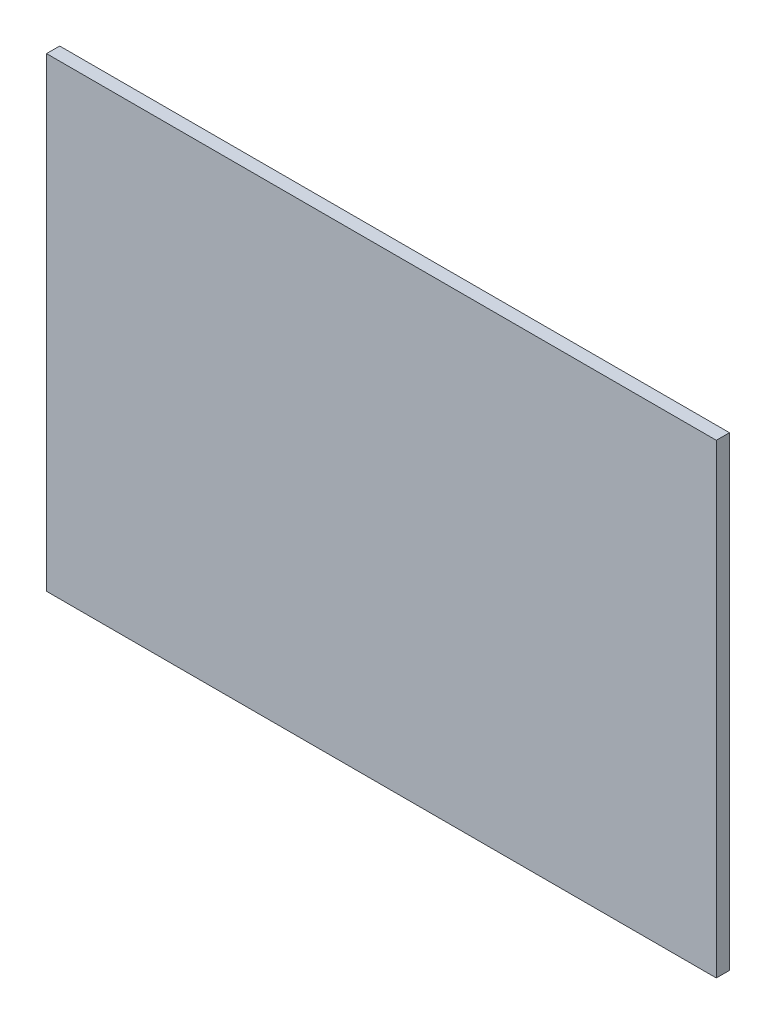
ISO-10303-21;
HEADER;
FILE_DESCRIPTION(('STEP AP214'),'2;1');
FILE_NAME('part.step','',(''),(''),'','','');
FILE_SCHEMA(('AUTOMOTIVE_DESIGN { 1 0 10303 214 1 1 1 1 }'));
ENDSEC;
DATA;
#1=APPLICATION_CONTEXT('core data for automotive mechanical design processes');
#2=APPLICATION_PROTOCOL_DEFINITION('international standard','automotive_design',2000,#1);
#3=PRODUCT_CONTEXT('',#1,'mechanical');
#4=PRODUCT('Part','Part','',(#3));
#5=PRODUCT_RELATED_PRODUCT_CATEGORY('part','',(#4));
#6=PRODUCT_DEFINITION_FORMATION('','',#4);
#7=PRODUCT_DEFINITION_CONTEXT('part definition',#1,'design');
#8=PRODUCT_DEFINITION('design','',#6,#7);
#9=PRODUCT_DEFINITION_SHAPE('','',#8);
#10=(LENGTH_UNIT() NAMED_UNIT(*) SI_UNIT(.MILLI.,.METRE.));
#11=(NAMED_UNIT(*) PLANE_ANGLE_UNIT() SI_UNIT($,.RADIAN.));
#12=(NAMED_UNIT(*) SI_UNIT($,.STERADIAN.) SOLID_ANGLE_UNIT());
#13=UNCERTAINTY_MEASURE_WITH_UNIT(LENGTH_MEASURE(1.E-05),#10,'distance_accuracy_value','');
#14=(GEOMETRIC_REPRESENTATION_CONTEXT(3) GLOBAL_UNCERTAINTY_ASSIGNED_CONTEXT((#13)) GLOBAL_UNIT_ASSIGNED_CONTEXT((#10,
#11,#12)) REPRESENTATION_CONTEXT('',''));
#15=CARTESIAN_POINT('',(0.,0.,0.));
#16=DIRECTION('',(0.,0.,1.));
#17=DIRECTION('',(1.,0.,0.));
#18=AXIS2_PLACEMENT_3D('',#15,#16,#17);
#19=CARTESIAN_POINT('',(-200.657789852813,58.4980133878326,3.175));
#20=DIRECTION('',(0.,1.,0.));
#21=DIRECTION('',(0.,0.,1.));
#22=AXIS2_PLACEMENT_3D('',#19,#20,#21);
#23=PLANE('',#22);
#24=DIRECTION('',(1.,0.,0.));
#25=VECTOR('',#24,1.);
#26=CARTESIAN_POINT('',(-200.657789852813,58.4980133878326,0.));
#27=LINE('',#26,#25);
#28=CARTESIAN_POINT('',(-207.007789852813,58.4980133878326,0.));
#29=VERTEX_POINT('',#28);
#30=CARTESIAN_POINT('',(-45.3527898528129,58.4980133878326,0.));
#31=VERTEX_POINT('',#30);
#32=EDGE_CURVE('E60',#29,#31,#27,.T.);
#33=ORIENTED_EDGE('',*,*,#32,.T.);
#34=DIRECTION('',(0.,0.,-1.));
#35=VECTOR('',#34,1.);
#36=CARTESIAN_POINT('',(-45.3527898528129,58.4980133878326,3.175));
#37=LINE('',#36,#35);
#38=CARTESIAN_POINT('',(-45.3527898528129,58.4980133878326,3.175));
#39=VERTEX_POINT('',#38);
#40=EDGE_CURVE('E11',#39,#31,#37,.T.);
#41=ORIENTED_EDGE('',*,*,#40,.F.);
#42=DIRECTION('',(1.,0.,0.));
#43=VECTOR('',#42,1.);
#44=CARTESIAN_POINT('',(-200.657789852813,58.4980133878326,3.175));
#45=LINE('',#44,#43);
#46=CARTESIAN_POINT('',(-207.007789852813,58.4980133878326,3.175));
#47=VERTEX_POINT('',#46);
#48=EDGE_CURVE('E87',#47,#39,#45,.T.);
#49=ORIENTED_EDGE('',*,*,#48,.F.);
#50=DIRECTION('',(0.,0.,1.));
#51=VECTOR('',#50,1.);
#52=CARTESIAN_POINT('',(-207.007789852813,58.4980133878326,0.));
#53=LINE('',#52,#51);
#54=EDGE_CURVE('E86',#29,#47,#53,.T.);
#55=ORIENTED_EDGE('',*,*,#54,.F.);
#56=EDGE_LOOP('',(#33,#41,#49,#55));
#57=FACE_BOUND('',#56,.T.);
#58=ADVANCED_FACE('F33',(#57),#23,.F.);
#59=CARTESIAN_POINT('',(-45.3527898528129,58.4980133878326,3.175));
#60=DIRECTION('',(-1.,0.,0.));
#61=DIRECTION('',(0.,0.,1.));
#62=AXIS2_PLACEMENT_3D('',#59,#60,#61);
#63=PLANE('',#62);
#64=DIRECTION('',(0.,1.,0.));
#65=VECTOR('',#64,1.);
#66=CARTESIAN_POINT('',(-45.3527898528129,58.4980133878326,0.));
#67=LINE('',#66,#65);
#68=CARTESIAN_POINT('',(-45.3527898528129,170.893013387833,0.));
#69=VERTEX_POINT('',#68);
#70=EDGE_CURVE('E82',#31,#69,#67,.T.);
#71=ORIENTED_EDGE('',*,*,#70,.T.);
#72=DIRECTION('',(0.,0.,-1.));
#73=VECTOR('',#72,1.);
#74=CARTESIAN_POINT('',(-45.3527898528129,170.893013387833,3.175));
#75=LINE('',#74,#73);
#76=CARTESIAN_POINT('',(-45.3527898528129,170.893013387833,3.175));
#77=VERTEX_POINT('',#76);
#78=EDGE_CURVE('E41',#77,#69,#75,.T.);
#79=ORIENTED_EDGE('',*,*,#78,.F.);
#80=DIRECTION('',(0.,1.,0.));
#81=VECTOR('',#80,1.);
#82=CARTESIAN_POINT('',(-45.3527898528129,58.4980133878326,3.175));
#83=LINE('',#82,#81);
#84=EDGE_CURVE('E49',#39,#77,#83,.T.);
#85=ORIENTED_EDGE('',*,*,#84,.F.);
#86=ORIENTED_EDGE('',*,*,#40,.T.);
#87=EDGE_LOOP('',(#71,#79,#85,#86));
#88=FACE_BOUND('',#87,.T.);
#89=ADVANCED_FACE('F106',(#88),#63,.F.);
#90=CARTESIAN_POINT('',(-200.657789852813,170.893013387833,3.175));
#91=DIRECTION('',(0.,-1.,0.));
#92=DIRECTION('',(0.,0.,-1.));
#93=AXIS2_PLACEMENT_3D('',#90,#91,#92);
#94=PLANE('',#93);
#95=DIRECTION('',(-1.,0.,0.));
#96=VECTOR('',#95,1.);
#97=CARTESIAN_POINT('',(-200.657789852813,170.893013387833,0.));
#98=LINE('',#97,#96);
#99=CARTESIAN_POINT('',(-207.007789852813,170.893013387833,0.));
#100=VERTEX_POINT('',#99);
#101=EDGE_CURVE('E68',#69,#100,#98,.T.);
#102=ORIENTED_EDGE('',*,*,#101,.T.);
#103=DIRECTION('',(0.,0.,-1.));
#104=VECTOR('',#103,1.);
#105=CARTESIAN_POINT('',(-207.007789852813,170.893013387833,0.));
#106=LINE('',#105,#104);
#107=CARTESIAN_POINT('',(-207.007789852813,170.893013387833,3.175));
#108=VERTEX_POINT('',#107);
#109=EDGE_CURVE('E83',#108,#100,#106,.T.);
#110=ORIENTED_EDGE('',*,*,#109,.F.);
#111=DIRECTION('',(-1.,0.,0.));
#112=VECTOR('',#111,1.);
#113=CARTESIAN_POINT('',(-200.657789852813,170.893013387833,3.175));
#114=LINE('',#113,#112);
#115=EDGE_CURVE('E100',#77,#108,#114,.T.);
#116=ORIENTED_EDGE('',*,*,#115,.F.);
#117=ORIENTED_EDGE('',*,*,#78,.T.);
#118=EDGE_LOOP('',(#102,#110,#116,#117));
#119=FACE_BOUND('',#118,.T.);
#120=ADVANCED_FACE('F104',(#119),#94,.F.);
#121=CARTESIAN_POINT('',(-200.657789852813,170.893013387833,3.175));
#122=DIRECTION('',(0.,0.,-1.));
#123=DIRECTION('',(-1.,0.,0.));
#124=AXIS2_PLACEMENT_3D('',#121,#122,#123);
#125=PLANE('',#124);
#126=ORIENTED_EDGE('',*,*,#115,.T.);
#127=DIRECTION('',(0.,1.,0.));
#128=VECTOR('',#127,1.);
#129=CARTESIAN_POINT('',(-207.007789852813,170.893013387833,3.175));
#130=LINE('',#129,#128);
#131=EDGE_CURVE('E91',#47,#108,#130,.T.);
#132=ORIENTED_EDGE('',*,*,#131,.F.);
#133=ORIENTED_EDGE('',*,*,#48,.T.);
#134=ORIENTED_EDGE('',*,*,#84,.T.);
#135=EDGE_LOOP('',(#126,#132,#133,#134));
#136=FACE_BOUND('',#135,.T.);
#137=ADVANCED_FACE('F112',(#136),#125,.F.);
#138=CARTESIAN_POINT('',(-200.657789852813,170.893013387833,0.));
#139=DIRECTION('',(0.,0.,-1.));
#140=DIRECTION('',(-1.,0.,0.));
#141=AXIS2_PLACEMENT_3D('',#138,#139,#140);
#142=PLANE('',#141);
#143=ORIENTED_EDGE('',*,*,#32,.F.);
#144=DIRECTION('',(0.,-1.,0.));
#145=VECTOR('',#144,1.);
#146=CARTESIAN_POINT('',(-207.007789852813,170.893013387833,0.));
#147=LINE('',#146,#145);
#148=EDGE_CURVE('E81',#100,#29,#147,.T.);
#149=ORIENTED_EDGE('',*,*,#148,.F.);
#150=ORIENTED_EDGE('',*,*,#101,.F.);
#151=ORIENTED_EDGE('',*,*,#70,.F.);
#152=EDGE_LOOP('',(#143,#149,#150,#151));
#153=FACE_BOUND('',#152,.T.);
#154=ADVANCED_FACE('F79',(#153),#142,.T.);
#155=CARTESIAN_POINT('',(-207.007789852813,58.4980133878326,0.));
#156=DIRECTION('',(-1.,0.,0.));
#157=DIRECTION('',(0.,0.,1.));
#158=AXIS2_PLACEMENT_3D('',#155,#156,#157);
#159=PLANE('',#158);
#160=ORIENTED_EDGE('',*,*,#148,.T.);
#161=ORIENTED_EDGE('',*,*,#54,.T.);
#162=ORIENTED_EDGE('',*,*,#131,.T.);
#163=ORIENTED_EDGE('',*,*,#109,.T.);
#164=EDGE_LOOP('',(#160,#161,#162,#163));
#165=FACE_BOUND('',#164,.T.);
#166=ADVANCED_FACE('F93',(#165),#159,.T.);
#167=CLOSED_SHELL('',(#58,#89,#120,#137,#154,#166));
#168=MANIFOLD_SOLID_BREP('B2',#167);
#169=ADVANCED_BREP_SHAPE_REPRESENTATION('',(#18,#168),#14);
#170=SHAPE_DEFINITION_REPRESENTATION(#9,#169);
ENDSEC;
END-ISO-10303-21;
